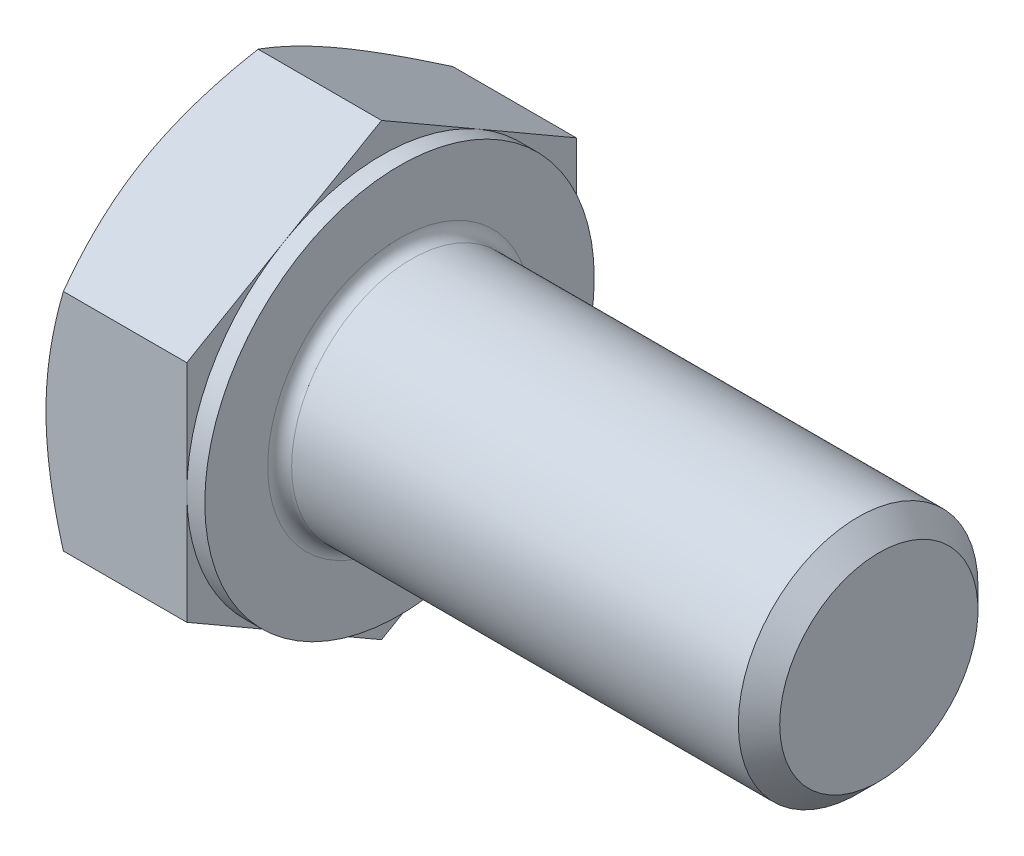
ISO-10303-21;
HEADER;
FILE_DESCRIPTION(('STEP AP214'),'2;1');
FILE_NAME('part.step','',(''),(''),'','','');
FILE_SCHEMA(('AUTOMOTIVE_DESIGN { 1 0 10303 214 1 1 1 1 }'));
ENDSEC;
DATA;
#1=APPLICATION_CONTEXT('core data for automotive mechanical design processes');
#2=APPLICATION_PROTOCOL_DEFINITION('international standard','automotive_design',2000,#1);
#3=PRODUCT_CONTEXT('',#1,'mechanical');
#4=PRODUCT('Part','Part','',(#3));
#5=PRODUCT_RELATED_PRODUCT_CATEGORY('part','',(#4));
#6=PRODUCT_DEFINITION_FORMATION('','',#4);
#7=PRODUCT_DEFINITION_CONTEXT('part definition',#1,'design');
#8=PRODUCT_DEFINITION('design','',#6,#7);
#9=PRODUCT_DEFINITION_SHAPE('','',#8);
#10=(LENGTH_UNIT() NAMED_UNIT(*) SI_UNIT(.MILLI.,.METRE.));
#11=(NAMED_UNIT(*) PLANE_ANGLE_UNIT() SI_UNIT($,.RADIAN.));
#12=(NAMED_UNIT(*) SI_UNIT($,.STERADIAN.) SOLID_ANGLE_UNIT());
#13=UNCERTAINTY_MEASURE_WITH_UNIT(LENGTH_MEASURE(1.E-05),#10,'distance_accuracy_value','');
#14=(GEOMETRIC_REPRESENTATION_CONTEXT(3) GLOBAL_UNCERTAINTY_ASSIGNED_CONTEXT((#13)) GLOBAL_UNIT_ASSIGNED_CONTEXT((#10,
#11,#12)) REPRESENTATION_CONTEXT('',''));
#15=CARTESIAN_POINT('',(0.,0.,0.));
#16=DIRECTION('',(0.,0.,1.));
#17=DIRECTION('',(1.,0.,0.));
#18=AXIS2_PLACEMENT_3D('',#15,#16,#17);
#19=CARTESIAN_POINT('',(5.3,7.50555349946514,0.));
#20=DIRECTION('',(1.,0.,0.));
#21=DIRECTION('',(0.,0.,-1.));
#22=AXIS2_PLACEMENT_3D('',#19,#20,#21);
#23=PLANE('',#22);
#24=CARTESIAN_POINT('',(5.3,0.,0.));
#25=DIRECTION('',(1.,0.,0.));
#26=DIRECTION('',(0.,0.,-1.));
#27=AXIS2_PLACEMENT_3D('',#24,#25,#26);
#28=CIRCLE('',#27,4.4);
#29=CARTESIAN_POINT('',(5.3,0.,-4.4));
#30=VERTEX_POINT('',#29);
#31=EDGE_CURVE('E50',#30,#30,#28,.F.);
#32=ORIENTED_EDGE('',*,*,#31,.T.);
#33=EDGE_LOOP('',(#32));
#34=FACE_BOUND('',#33,.T.);
#35=CARTESIAN_POINT('',(5.3,0.,0.));
#36=DIRECTION('',(1.,0.,0.));
#37=DIRECTION('',(0.,0.,-1.));
#38=AXIS2_PLACEMENT_3D('',#35,#36,#37);
#39=CIRCLE('',#38,6.5);
#40=CARTESIAN_POINT('',(5.3,0.,-6.5));
#41=VERTEX_POINT('',#40);
#42=EDGE_CURVE('E269',#41,#41,#39,.T.);
#43=ORIENTED_EDGE('',*,*,#42,.T.);
#44=EDGE_LOOP('',(#43));
#45=FACE_BOUND('',#44,.T.);
#46=ADVANCED_FACE('F41',(#34,#45),#23,.T.);
#47=CARTESIAN_POINT('',(0.,0.,0.));
#48=DIRECTION('',(-1.,0.,0.));
#49=DIRECTION('',(0.,0.,1.));
#50=AXIS2_PLACEMENT_3D('',#47,#48,#49);
#51=CYLINDRICAL_SURFACE('',#50,4.);
#52=CARTESIAN_POINT('',(5.7,0.,0.));
#53=DIRECTION('',(1.,0.,0.));
#54=DIRECTION('',(0.,0.,-1.));
#55=AXIS2_PLACEMENT_3D('',#52,#53,#54);
#56=CIRCLE('',#55,4.);
#57=CARTESIAN_POINT('',(5.7,0.,-4.));
#58=VERTEX_POINT('',#57);
#59=EDGE_CURVE('E11',#58,#58,#56,.T.);
#60=ORIENTED_EDGE('',*,*,#59,.T.);
#61=EDGE_LOOP('',(#60));
#62=FACE_BOUND('',#61,.T.);
#63=CARTESIAN_POINT('',(20.6095,0.,0.));
#64=DIRECTION('',(-1.,0.,0.));
#65=DIRECTION('',(0.,0.,1.));
#66=AXIS2_PLACEMENT_3D('',#63,#64,#65);
#67=CIRCLE('',#66,4.);
#68=CARTESIAN_POINT('',(20.6095,0.,4.));
#69=VERTEX_POINT('',#68);
#70=EDGE_CURVE('E313',#69,#69,#67,.T.);
#71=ORIENTED_EDGE('',*,*,#70,.T.);
#72=EDGE_LOOP('',(#71));
#73=FACE_BOUND('',#72,.T.);
#74=ADVANCED_FACE('F256',(#62,#73),#51,.T.);
#75=CARTESIAN_POINT('',(21.3,0.,0.));
#76=DIRECTION('',(-1.,0.,0.));
#77=DIRECTION('',(0.,0.,1.));
#78=AXIS2_PLACEMENT_3D('',#75,#76,#77);
#79=CONICAL_SURFACE('',#78,3.3095,0.785398163397441);
#80=ORIENTED_EDGE('',*,*,#70,.F.);
#81=EDGE_LOOP('',(#80));
#82=FACE_BOUND('',#81,.T.);
#83=CARTESIAN_POINT('',(21.3,0.,0.));
#84=DIRECTION('',(-1.,0.,0.));
#85=DIRECTION('',(0.,0.,1.));
#86=AXIS2_PLACEMENT_3D('',#83,#84,#85);
#87=CIRCLE('',#86,3.3095);
#88=CARTESIAN_POINT('',(21.3,0.,3.3095));
#89=VERTEX_POINT('',#88);
#90=EDGE_CURVE('E315',#89,#89,#87,.T.);
#91=ORIENTED_EDGE('',*,*,#90,.T.);
#92=EDGE_LOOP('',(#91));
#93=FACE_BOUND('',#92,.T.);
#94=ADVANCED_FACE('F261',(#82,#93),#79,.T.);
#95=CARTESIAN_POINT('',(21.3,0.,0.));
#96=DIRECTION('',(-1.,0.,0.));
#97=DIRECTION('',(0.,0.,1.));
#98=AXIS2_PLACEMENT_3D('',#95,#96,#97);
#99=PLANE('',#98);
#100=ORIENTED_EDGE('',*,*,#90,.F.);
#101=EDGE_LOOP('',(#100));
#102=FACE_BOUND('',#101,.T.);
#103=ADVANCED_FACE('F362',(#102),#99,.F.);
#104=CARTESIAN_POINT('',(4.7,6.5,0.));
#105=DIRECTION('',(1.,0.,0.));
#106=DIRECTION('',(0.,0.,-1.));
#107=AXIS2_PLACEMENT_3D('',#104,#105,#106);
#108=PLANE('',#107);
#109=DIRECTION('',(0.,0.500000000000001,0.866025403784438));
#110=VECTOR('',#109,1.);
#111=CARTESIAN_POINT('',(4.7,3.75277674973256,-6.5));
#112=LINE('',#111,#110);
#113=CARTESIAN_POINT('',(4.7,3.75277674973256,-6.5));
#114=VERTEX_POINT('',#113);
#115=CARTESIAN_POINT('',(4.7,5.62916512459885,-3.25));
#116=VERTEX_POINT('',#115);
#117=EDGE_CURVE('E174',#114,#116,#112,.T.);
#118=ORIENTED_EDGE('',*,*,#117,.T.);
#119=CARTESIAN_POINT('',(4.7,0.,0.));
#120=DIRECTION('',(-1.,0.,0.));
#121=DIRECTION('',(0.,0.,1.));
#122=AXIS2_PLACEMENT_3D('',#119,#120,#121);
#123=CIRCLE('',#122,6.5);
#124=CARTESIAN_POINT('',(4.7,0.,-6.5));
#125=VERTEX_POINT('',#124);
#126=EDGE_CURVE('E57',#116,#125,#123,.T.);
#127=ORIENTED_EDGE('',*,*,#126,.T.);
#128=DIRECTION('',(0.,1.,0.));
#129=VECTOR('',#128,1.);
#130=CARTESIAN_POINT('',(4.7,3.75277674973256,-6.5));
#131=LINE('',#130,#129);
#132=EDGE_CURVE('E270',#125,#114,#131,.T.);
#133=ORIENTED_EDGE('',*,*,#132,.T.);
#134=EDGE_LOOP('',(#118,#127,#133));
#135=FACE_BOUND('',#134,.T.);
#136=ADVANCED_FACE('F292',(#135),#108,.T.);
#137=CARTESIAN_POINT('',(4.7,7.50555349946514,0.));
#138=VERTEX_POINT('',#137);
#139=EDGE_CURVE('E172',#116,#138,#112,.T.);
#140=ORIENTED_EDGE('',*,*,#139,.T.);
#141=DIRECTION('',(0.,-0.500000000000001,0.866025403784438));
#142=VECTOR('',#141,1.);
#143=CARTESIAN_POINT('',(4.7,7.50555349946514,0.));
#144=LINE('',#143,#142);
#145=CARTESIAN_POINT('',(4.7,5.62916512459885,3.25));
#146=VERTEX_POINT('',#145);
#147=EDGE_CURVE('E171',#138,#146,#144,.T.);
#148=ORIENTED_EDGE('',*,*,#147,.T.);
#149=EDGE_CURVE('E160',#146,#116,#123,.T.);
#150=ORIENTED_EDGE('',*,*,#149,.T.);
#151=EDGE_LOOP('',(#140,#148,#150));
#152=FACE_BOUND('',#151,.T.);
#153=ADVANCED_FACE('F299',(#152),#108,.T.);
#154=CARTESIAN_POINT('',(4.7,3.75277674973257,6.5));
#155=VERTEX_POINT('',#154);
#156=EDGE_CURVE('E139',#146,#155,#144,.T.);
#157=ORIENTED_EDGE('',*,*,#156,.T.);
#158=DIRECTION('',(0.,-1.,0.));
#159=VECTOR('',#158,1.);
#160=CARTESIAN_POINT('',(4.7,3.75277674973257,6.5));
#161=LINE('',#160,#159);
#162=CARTESIAN_POINT('',(4.7,0.,6.5));
#163=VERTEX_POINT('',#162);
#164=EDGE_CURVE('E133',#155,#163,#161,.T.);
#165=ORIENTED_EDGE('',*,*,#164,.T.);
#166=EDGE_CURVE('E137',#163,#146,#123,.T.);
#167=ORIENTED_EDGE('',*,*,#166,.T.);
#168=EDGE_LOOP('',(#157,#165,#167));
#169=FACE_BOUND('',#168,.T.);
#170=ADVANCED_FACE('F135',(#169),#108,.T.);
#171=CARTESIAN_POINT('',(4.7,-3.75277674973257,6.5));
#172=VERTEX_POINT('',#171);
#173=EDGE_CURVE('E143',#163,#172,#161,.T.);
#174=ORIENTED_EDGE('',*,*,#173,.T.);
#175=DIRECTION('',(0.,-0.500000000000001,-0.866025403784438));
#176=VECTOR('',#175,1.);
#177=CARTESIAN_POINT('',(4.7,-7.50555349946515,0.));
#178=LINE('',#177,#176);
#179=CARTESIAN_POINT('',(4.7,-5.62916512459885,3.25000000000001));
#180=VERTEX_POINT('',#179);
#181=EDGE_CURVE('E150',#172,#180,#178,.T.);
#182=ORIENTED_EDGE('',*,*,#181,.T.);
#183=EDGE_CURVE('E147',#180,#163,#123,.T.);
#184=ORIENTED_EDGE('',*,*,#183,.T.);
#185=EDGE_LOOP('',(#174,#182,#184));
#186=FACE_BOUND('',#185,.T.);
#187=ADVANCED_FACE('F148',(#186),#108,.T.);
#188=CARTESIAN_POINT('',(4.7,-7.50555349946515,0.));
#189=VERTEX_POINT('',#188);
#190=EDGE_CURVE('E166',#180,#189,#178,.T.);
#191=ORIENTED_EDGE('',*,*,#190,.T.);
#192=DIRECTION('',(0.,0.5,-0.866025403784438));
#193=VECTOR('',#192,1.);
#194=CARTESIAN_POINT('',(4.7,-3.75277674973257,-6.5));
#195=LINE('',#194,#193);
#196=CARTESIAN_POINT('',(4.7,-5.62916512459885,-3.25));
#197=VERTEX_POINT('',#196);
#198=EDGE_CURVE('E353',#189,#197,#195,.T.);
#199=ORIENTED_EDGE('',*,*,#198,.T.);
#200=EDGE_CURVE('E154',#197,#180,#123,.T.);
#201=ORIENTED_EDGE('',*,*,#200,.T.);
#202=EDGE_LOOP('',(#191,#199,#201));
#203=FACE_BOUND('',#202,.T.);
#204=ADVANCED_FACE('F354',(#203),#108,.T.);
#205=CARTESIAN_POINT('',(4.7,-3.75277674973257,-6.5));
#206=VERTEX_POINT('',#205);
#207=EDGE_CURVE('E161',#197,#206,#195,.T.);
#208=ORIENTED_EDGE('',*,*,#207,.T.);
#209=EDGE_CURVE('E273',#206,#125,#131,.T.);
#210=ORIENTED_EDGE('',*,*,#209,.T.);
#211=EDGE_CURVE('E285',#125,#197,#123,.T.);
#212=ORIENTED_EDGE('',*,*,#211,.T.);
#213=EDGE_LOOP('',(#208,#210,#212));
#214=FACE_BOUND('',#213,.T.);
#215=ADVANCED_FACE('F284',(#214),#108,.T.);
#216=CARTESIAN_POINT('',(0.,0.,0.));
#217=DIRECTION('',(-1.,0.,0.));
#218=DIRECTION('',(0.,0.,1.));
#219=AXIS2_PLACEMENT_3D('',#216,#217,#218);
#220=CYLINDRICAL_SURFACE('',#219,6.5);
#221=ORIENTED_EDGE('',*,*,#126,.F.);
#222=ORIENTED_EDGE('',*,*,#149,.F.);
#223=ORIENTED_EDGE('',*,*,#166,.F.);
#224=ORIENTED_EDGE('',*,*,#183,.F.);
#225=ORIENTED_EDGE('',*,*,#200,.F.);
#226=ORIENTED_EDGE('',*,*,#211,.F.);
#227=EDGE_LOOP('',(#221,#222,#223,#224,#225,#226));
#228=FACE_BOUND('',#227,.T.);
#229=ORIENTED_EDGE('',*,*,#42,.F.);
#230=EDGE_LOOP('',(#229));
#231=FACE_BOUND('',#230,.T.);
#232=ADVANCED_FACE('F157',(#228,#231),#220,.T.);
#233=CARTESIAN_POINT('',(0.,7.50555349946514,0.));
#234=DIRECTION('',(1.,0.,0.));
#235=DIRECTION('',(0.,0.,-1.));
#236=AXIS2_PLACEMENT_3D('',#233,#234,#235);
#237=PLANE('',#236);
#238=CARTESIAN_POINT('',(0.,0.,0.));
#239=DIRECTION('',(1.,0.,0.));
#240=DIRECTION('',(0.,0.,-1.));
#241=AXIS2_PLACEMENT_3D('',#238,#239,#240);
#242=CIRCLE('',#241,6.5);
#243=CARTESIAN_POINT('',(0.,0.,-6.5));
#244=VERTEX_POINT('',#243);
#245=CARTESIAN_POINT('',(0.,5.62916512459885,-3.25000000000001));
#246=VERTEX_POINT('',#245);
#247=EDGE_CURVE('E271',#244,#246,#242,.T.);
#248=ORIENTED_EDGE('',*,*,#247,.F.);
#249=CARTESIAN_POINT('',(0.,-5.62916512459885,-3.25));
#250=VERTEX_POINT('',#249);
#251=EDGE_CURVE('E277',#250,#244,#242,.T.);
#252=ORIENTED_EDGE('',*,*,#251,.F.);
#253=CARTESIAN_POINT('',(0.,-5.62916512459885,3.25000000000001));
#254=VERTEX_POINT('',#253);
#255=EDGE_CURVE('E335',#254,#250,#242,.T.);
#256=ORIENTED_EDGE('',*,*,#255,.F.);
#257=CARTESIAN_POINT('',(0.,0.,6.5));
#258=VERTEX_POINT('',#257);
#259=EDGE_CURVE('E331',#258,#254,#242,.T.);
#260=ORIENTED_EDGE('',*,*,#259,.F.);
#261=CARTESIAN_POINT('',(0.,0.,0.));
#262=DIRECTION('',(-1.,0.,0.));
#263=DIRECTION('',(0.,0.,1.));
#264=AXIS2_PLACEMENT_3D('',#261,#262,#263);
#265=CIRCLE('',#264,6.5);
#266=CARTESIAN_POINT('',(0.,5.62916512459885,3.25));
#267=VERTEX_POINT('',#266);
#268=EDGE_CURVE('E175',#258,#267,#265,.T.);
#269=ORIENTED_EDGE('',*,*,#268,.T.);
#270=EDGE_CURVE('E275',#246,#267,#242,.T.);
#271=ORIENTED_EDGE('',*,*,#270,.F.);
#272=EDGE_LOOP('',(#248,#252,#256,#260,#269,#271));
#273=FACE_BOUND('',#272,.T.);
#274=ADVANCED_FACE('F332',(#273),#237,.F.);
#275=CARTESIAN_POINT('',(0.,0.,0.));
#276=DIRECTION('',(1.,0.,0.));
#277=DIRECTION('',(0.,0.,-1.));
#278=AXIS2_PLACEMENT_3D('',#275,#276,#277);
#279=CONICAL_SURFACE('',#278,6.5,1.0471975511966);
#280=CARTESIAN_POINT('',(0.580623251805861,3.75266127967873,6.5002));
#281=CARTESIAN_POINT('',(0.53300442307548,3.8351516191275,6.35732254094112));
#282=CARTESIAN_POINT('',(0.487546700602701,3.91794952254312,6.21391236546509));
#283=CARTESIAN_POINT('',(0.401548682023042,4.08421773795794,5.9259273686828));
#284=CARTESIAN_POINT('',(0.361010507228022,4.16768832359105,5.78135207342874));
#285=CARTESIAN_POINT('',(0.247571001123207,4.41943655294051,5.34531134947997));
#286=CARTESIAN_POINT('',(0.183047807128738,4.58870793403689,5.05212471715368));
#287=CARTESIAN_POINT('',(0.107386583547491,4.84201947708215,4.61337625445563));
#288=CARTESIAN_POINT('',(0.0858328564569874,4.92530276780316,4.46912536350531));
#289=CARTESIAN_POINT('',(0.0496903146061193,5.09224566542477,4.17997178286191));
#290=CARTESIAN_POINT('',(0.0351008844596669,5.17590523841627,4.03506915190111));
#291=CARTESIAN_POINT('',(0.0132587525073473,5.34336968579964,3.74501222057168));
#292=CARTESIAN_POINT('',(0.0059977243221085,5.427174286676,3.59985839394579));
#293=CARTESIAN_POINT('',(-0.00103969741776754,5.59485627940483,3.30942466302506));
#294=CARTESIAN_POINT('',(-0.000816322187794126,5.6787336689286,3.16414476276365));
#295=CARTESIAN_POINT('',(0.0100834585151664,5.90853103021317,2.76612405757351));
#296=CARTESIAN_POINT('',(0.0283818178694138,6.05437578112763,2.51351353897243));
#297=CARTESIAN_POINT('',(0.086406341457675,6.34509659313135,2.00997032176432));
#298=CARTESIAN_POINT('',(0.126152338538245,6.48997163178545,1.75903939406692));
#299=CARTESIAN_POINT('',(0.225505903202149,6.78127752911039,1.25448277935568));
#300=CARTESIAN_POINT('',(0.285534425638026,6.92767163007068,1.00092075856409));
#301=CARTESIAN_POINT('',(0.421774992509867,7.21827667013277,0.497578064240956));
#302=CARTESIAN_POINT('',(0.497955034163591,7.36249133098589,0.247790944447036));
#303=CARTESIAN_POINT('',(0.580623251805865,7.50566896951898,-0.000200000000000185));
#304=B_SPLINE_CURVE_WITH_KNOTS('',3,(#280,#281,#282,#283,#284,#285,#286,#287,#288,#289,#290,
#291,#292,#293,#294,#295,#296,#297,#298,#299,#300,#301,#302,#303),.UNSPECIFIED.,.F.,.F.,(4,2,2,
2,2,2,2,2,2,2,2,4),(0.,0.515105052395587,1.03043143507524,2.06322554824262,2.56697389547996,
3.07067772176453,3.57380860368927,4.07692394242519,4.9527935470566,5.82947446853466,
6.72559912449736,7.61996451221046),.UNSPECIFIED.);
#305=CARTESIAN_POINT('',(0.580556583600761,7.50555349946514,0.));
#306=VERTEX_POINT('',#305);
#307=EDGE_CURVE('E224',#267,#306,#304,.T.);
#308=ORIENTED_EDGE('',*,*,#307,.T.);
#309=CARTESIAN_POINT('',(0.580623251805865,7.50566896951898,0.000199999999999942));
#310=CARTESIAN_POINT('',(0.533004423075484,7.4231786300702,-0.14267745905888));
#311=CARTESIAN_POINT('',(0.487546700602705,7.34038072665458,-0.286087634534912));
#312=CARTESIAN_POINT('',(0.401548682023045,7.17411251123976,-0.574072631317194));
#313=CARTESIAN_POINT('',(0.361010507228024,7.09064192560665,-0.718647926571263));
#314=CARTESIAN_POINT('',(0.247571001123208,6.83889369625719,-1.15468865052003));
#315=CARTESIAN_POINT('',(0.18304780712874,6.66962231516081,-1.44787528284632));
#316=CARTESIAN_POINT('',(0.107386583547492,6.41631077211555,-1.88662374554437));
#317=CARTESIAN_POINT('',(0.0858328564569881,6.33302748139454,-2.03087463649469));
#318=CARTESIAN_POINT('',(0.0496903146061196,6.16608458377293,-2.32002821713809));
#319=CARTESIAN_POINT('',(0.0351008844596673,6.08242501078143,-2.46493084809889));
#320=CARTESIAN_POINT('',(0.0132587525073475,5.91496056339807,-2.75498777942832));
#321=CARTESIAN_POINT('',(0.00599772432210842,5.8311559625217,-2.90014160605421));
#322=CARTESIAN_POINT('',(-0.00103969741776819,5.66347396979287,-3.19057533697495));
#323=CARTESIAN_POINT('',(-0.000816322187795032,5.5795965802691,-3.33585523723635));
#324=CARTESIAN_POINT('',(0.0100834585151652,5.34979921898453,-3.73387594242649));
#325=CARTESIAN_POINT('',(0.0283818178694129,5.20395446807007,-3.98648646102757));
#326=CARTESIAN_POINT('',(0.0864063414576737,4.91323365606636,-4.49002967823568));
#327=CARTESIAN_POINT('',(0.126152338538243,4.76835861741226,-4.74096060593308));
#328=CARTESIAN_POINT('',(0.225505903202146,4.47705272008732,-5.24551722064432));
#329=CARTESIAN_POINT('',(0.285534425638022,4.33065861912702,-5.49907924143591));
#330=CARTESIAN_POINT('',(0.421774992509863,4.04005357906493,-6.00242193575904));
#331=CARTESIAN_POINT('',(0.497955034163587,3.89583891821181,-6.25220905555296));
#332=CARTESIAN_POINT('',(0.580623251805861,3.75266127967873,-6.5002));
#333=B_SPLINE_CURVE_WITH_KNOTS('',3,(#309,#310,#311,#312,#313,#314,#315,#316,#317,#318,#319,
#320,#321,#322,#323,#324,#325,#326,#327,#328,#329,#330,#331,#332),.UNSPECIFIED.,.F.,.F.,(4,2,2,
2,2,2,2,2,2,2,2,4),(0.,0.515105052395587,1.03043143507524,2.06322554824262,2.56697389547996,
3.07067772176453,3.57380860368928,4.0769239424252,4.9527935470566,5.82947446853466,
6.72559912449736,7.61996451221046),.UNSPECIFIED.);
#334=EDGE_CURVE('E65',#306,#246,#333,.T.);
#335=ORIENTED_EDGE('',*,*,#334,.T.);
#336=ORIENTED_EDGE('',*,*,#270,.T.);
#337=EDGE_LOOP('',(#308,#335,#336));
#338=FACE_BOUND('',#337,.T.);
#339=ADVANCED_FACE('F329',(#338),#279,.T.);
#340=CARTESIAN_POINT('',(3.18835311563216,-10.1137456673369,6.5));
#341=CARTESIAN_POINT('',(3.05034773984569,-9.82952666268363,6.5));
#342=CARTESIAN_POINT('',(2.91365616465169,-9.54465869597371,6.5));
#343=CARTESIAN_POINT('',(2.64363899475027,-8.9732797800977,6.5));
#344=CARTESIAN_POINT('',(2.51031392437707,-8.68676858342199,6.5));
#345=CARTESIAN_POINT('',(2.24710473463579,-8.11029837800201,6.5));
#346=CARTESIAN_POINT('',(2.11724300420665,-7.82032911160932,6.5));
#347=CARTESIAN_POINT('',(1.8627908281112,-7.23809540985589,6.5));
#348=CARTESIAN_POINT('',(1.73820013539997,-6.94583108282378,6.5));
#349=CARTESIAN_POINT('',(1.49176685414525,-6.34906440932191,6.5));
#350=CARTESIAN_POINT('',(1.37014257629961,-6.04447142260091,6.5));
#351=CARTESIAN_POINT('',(1.13601865749048,-5.43173420932697,6.5));
#352=CARTESIAN_POINT('',(1.02352003549992,-5.12358959057326,6.5));
#353=CARTESIAN_POINT('',(0.810575368179996,-4.50382569763974,6.5));
#354=CARTESIAN_POINT('',(0.71010523225176,-4.19221478250845,6.5));
#355=CARTESIAN_POINT('',(0.524420166111963,-3.56452019194196,6.5));
#356=CARTESIAN_POINT('',(0.439200468182006,-3.248437947833,6.5));
#357=CARTESIAN_POINT('',(0.288524223393067,-2.61335465708694,6.5));
#358=CARTESIAN_POINT('',(0.22296186574418,-2.29437912058767,6.5));
#359=CARTESIAN_POINT('',(0.115312883140192,-1.65238219411908,6.5));
#360=CARTESIAN_POINT('',(0.0732239014810092,-1.32936121363907,6.5));
#361=CARTESIAN_POINT('',(0.0304887136492793,-0.845231171985981,6.5));
#362=CARTESIAN_POINT('',(0.0196493434374818,-0.684982209825929,6.5));
#363=CARTESIAN_POINT('',(0.00475298486802839,-0.364162349261911,6.5));
#364=CARTESIAN_POINT('',(0.000695882912926891,-0.203591456295124,6.5));
#365=CARTESIAN_POINT('',(-0.000531597192431542,0.117577430127593,6.5));
#366=CARTESIAN_POINT('',(0.00229809016385244,0.278175423826775,6.5));
#367=CARTESIAN_POINT('',(0.0147726845392768,0.599108972527027,6.5));
#368=CARTESIAN_POINT('',(0.0244179260292899,0.759444514261294,6.5));
#369=CARTESIAN_POINT('',(0.0554961939005601,1.1436994656868,6.5));
#370=CARTESIAN_POINT('',(0.0801030490102252,1.36736763010324,6.5));
#371=CARTESIAN_POINT('',(0.141246537396775,1.81305591275148,6.5));
#372=CARTESIAN_POINT('',(0.177784759549959,2.035075807457,6.5));
#373=CARTESIAN_POINT('',(0.303360001243783,2.69839633393827,6.5));
#374=CARTESIAN_POINT('',(0.408335815043154,3.13672010332748,6.5));
#375=CARTESIAN_POINT('',(0.590564593006713,3.79232112874054,6.5));
#376=CARTESIAN_POINT('',(0.65631319884288,4.01299150829173,6.5));
#377=CARTESIAN_POINT('',(0.794681634048787,4.45218858961829,6.5));
#378=CARTESIAN_POINT('',(0.867301512962924,4.67071527592431,6.5));
#379=CARTESIAN_POINT('',(1.01824353836803,5.10569490203691,6.5));
#380=CARTESIAN_POINT('',(1.09656388214599,5.3221484731522,6.5));
#381=CARTESIAN_POINT('',(1.25798086145111,5.75325725721542,6.5));
#382=CARTESIAN_POINT('',(1.34107741015563,5.96791250277239,6.5));
#383=CARTESIAN_POINT('',(1.56029019561416,6.51888445883546,6.5));
#384=CARTESIAN_POINT('',(1.69936356644503,6.85402316761092,6.5));
#385=CARTESIAN_POINT('',(1.98501958064622,7.52109583887404,6.5));
#386=CARTESIAN_POINT('',(2.13160288757765,7.85302951508199,6.5));
#387=CARTESIAN_POINT('',(2.43059748021416,8.51437865467408,6.5));
#388=CARTESIAN_POINT('',(2.5830105757321,8.84379329733072,6.5));
#389=CARTESIAN_POINT('',(2.89234869350807,9.50047798633195,6.5));
#390=CARTESIAN_POINT('',(3.04927357195784,9.82774810062372,6.5));
#391=CARTESIAN_POINT('',(3.366920131061,10.4809971970749,6.5));
#392=CARTESIAN_POINT('',(3.5276467646709,10.8069737662429,6.5));
#393=CARTESIAN_POINT('',(3.85198555530078,11.4574882896093,6.5));
#394=CARTESIAN_POINT('',(4.01559773098171,11.7820262344869,6.5));
#395=CARTESIAN_POINT('',(4.50986184978696,12.753746810957,6.5));
#396=CARTESIAN_POINT('',(4.84399997953391,13.3991555927631,6.5));
#397=CARTESIAN_POINT('',(5.48575990240554,14.6239779286089,6.5));
#398=CARTESIAN_POINT('',(5.79279643346762,15.20369957558,6.5));
#399=CARTESIAN_POINT('',(6.41069188201843,16.3611382633071,6.5));
#400=CARTESIAN_POINT('',(6.72155098984202,16.9388552023926,6.5));
#401=CARTESIAN_POINT('',(7.34519775412865,18.0910273551188,6.5));
#402=CARTESIAN_POINT('',(7.65797694142592,18.6654871601314,6.5));
#403=CARTESIAN_POINT('',(8.28574397126577,19.8131486199609,6.5));
#404=CARTESIAN_POINT('',(8.6007316626767,20.3863503574121,6.5));
#405=CARTESIAN_POINT('',(8.91652967142029,20.9591024516606,6.5));
#406=B_SPLINE_CURVE_WITH_KNOTS('',3,(#340,#341,#342,#343,#344,#345,#346,#347,#348,#349,#350,
#351,#352,#353,#354,#355,#356,#357,#358,#359,#360,#361,#362,#363,#364,#365,#366,#367,#368,#369,
#370,#371,#372,#373,#374,#375,#376,#377,#378,#379,#380,#381,#382,#383,#384,#385,#386,#387,#388,
#389,#390,#391,#392,#393,#394,#395,#396,#397,#398,#399,#400,#401,#402,#403,#404,#405),
.UNSPECIFIED.,.F.,.F.,(4,2,2,2,2,2,2,2,2,2,2,2,2,2,2,2,2,2,2,2,2,2,2,2,2,2,2,2,2,2,2,2,4),(0.,
0.947868666637001,1.89588406470428,2.84900320910869,3.80207763278045,4.7858977404943,
5.76982755101459,6.75175256199403,7.73337005710129,8.70960474826444,9.68574140876309,
10.1674651045585,10.6491807317952,11.1309009410869,11.612644792267,12.2873175714037,
12.9620802320305,14.3123184370259,15.0030310333297,15.6937486103039,16.3842486961975,
17.074736234034,18.1631508671878,19.2516618366358,20.3405135130783,21.4293305219254,
22.519654053591,23.6099846390269,25.7902468223405,27.7582608860787,29.7263733417655,
31.6886408583916,33.6507753794604),.UNSPECIFIED.);
#407=CARTESIAN_POINT('',(0.580556583600757,3.75277674973256,6.5));
#408=VERTEX_POINT('',#407);
#409=EDGE_CURVE('E238',#258,#408,#406,.T.);
#410=ORIENTED_EDGE('',*,*,#409,.T.);
#411=EDGE_CURVE('E237',#408,#267,#304,.T.);
#412=ORIENTED_EDGE('',*,*,#411,.T.);
#413=ORIENTED_EDGE('',*,*,#268,.F.);
#414=EDGE_LOOP('',(#410,#412,#413));
#415=FACE_BOUND('',#414,.T.);
#416=ADVANCED_FACE('F326',(#415),#279,.T.);
#417=CARTESIAN_POINT('',(0.580556583600758,-3.75277674973257,6.5));
#418=VERTEX_POINT('',#417);
#419=EDGE_CURVE('E317',#418,#258,#406,.T.);
#420=ORIENTED_EDGE('',*,*,#419,.T.);
#421=ORIENTED_EDGE('',*,*,#259,.T.);
#422=CARTESIAN_POINT('',(0.580623251805869,-7.50566896951898,-0.000199999999999312));
#423=CARTESIAN_POINT('',(0.533004423075487,-7.42317863007021,0.142677459058881));
#424=CARTESIAN_POINT('',(0.487546700602708,-7.34038072665459,0.286087634534913));
#425=CARTESIAN_POINT('',(0.401548682023049,-7.17411251123977,0.574072631317195));
#426=CARTESIAN_POINT('',(0.361010507228029,-7.09064192560666,0.718647926571265));
#427=CARTESIAN_POINT('',(0.247571001123213,-6.8388936962572,1.15468865052003));
#428=CARTESIAN_POINT('',(0.183047807128744,-6.66962231516082,1.44787528284632));
#429=CARTESIAN_POINT('',(0.107386583547496,-6.41631077211556,1.88662374554437));
#430=CARTESIAN_POINT('',(0.0858328564569919,-6.33302748139455,2.03087463649469));
#431=CARTESIAN_POINT('',(0.0496903146061238,-6.16608458377294,2.32002821713809));
#432=CARTESIAN_POINT('',(0.0351008844596716,-6.08242501078144,2.46493084809889));
#433=CARTESIAN_POINT('',(0.0132587525073517,-5.91496056339807,2.75498777942832));
#434=CARTESIAN_POINT('',(0.00599772432211233,-5.83115596252171,2.90014160605421));
#435=CARTESIAN_POINT('',(-0.00103969741776435,-5.66347396979287,3.19057533697495));
#436=CARTESIAN_POINT('',(-0.000816322187790917,-5.57959658026911,3.33585523723636));
#437=CARTESIAN_POINT('',(0.0100834585151693,-5.34979921898454,3.73387594242649));
#438=CARTESIAN_POINT('',(0.0283818178694163,-5.20395446807007,3.98648646102757));
#439=CARTESIAN_POINT('',(0.0864063414576766,-4.91323365606636,4.49002967823568));
#440=CARTESIAN_POINT('',(0.126152338538246,-4.76835861741226,4.74096060593308));
#441=CARTESIAN_POINT('',(0.225505903202149,-4.47705272008732,5.24551722064432));
#442=CARTESIAN_POINT('',(0.285534425638026,-4.33065861912703,5.49907924143591));
#443=CARTESIAN_POINT('',(0.421774992509866,-4.04005357906494,6.00242193575904));
#444=CARTESIAN_POINT('',(0.497955034163589,-3.89583891821182,6.25220905555296));
#445=CARTESIAN_POINT('',(0.580623251805863,-3.75266127967873,6.5002));
#446=B_SPLINE_CURVE_WITH_KNOTS('',3,(#422,#423,#424,#425,#426,#427,#428,#429,#430,#431,#432,
#433,#434,#435,#436,#437,#438,#439,#440,#441,#442,#443,#444,#445),.UNSPECIFIED.,.F.,.F.,(4,2,2,
2,2,2,2,2,2,2,2,4),(0.,0.515105052395588,1.03043143507525,2.06322554824262,2.56697389547997,
3.07067772176454,3.57380860368928,4.0769239424252,4.9527935470566,5.82947446853467,
6.72559912449736,7.61996451221046),.UNSPECIFIED.);
#447=EDGE_CURVE('E226',#254,#418,#446,.T.);
#448=ORIENTED_EDGE('',*,*,#447,.T.);
#449=EDGE_LOOP('',(#420,#421,#448));
#450=FACE_BOUND('',#449,.T.);
#451=ADVANCED_FACE('F195',(#450),#279,.T.);
#452=CARTESIAN_POINT('',(0.580556583600765,-7.50555349946515,0.));
#453=VERTEX_POINT('',#452);
#454=EDGE_CURVE('E218',#453,#254,#446,.T.);
#455=ORIENTED_EDGE('',*,*,#454,.T.);
#456=ORIENTED_EDGE('',*,*,#255,.T.);
#457=CARTESIAN_POINT('',(0.580623251805865,-3.75266127967874,-6.5002));
#458=CARTESIAN_POINT('',(0.533004423075483,-3.83515161912751,-6.35732254094112));
#459=CARTESIAN_POINT('',(0.487546700602705,-3.91794952254313,-6.21391236546509));
#460=CARTESIAN_POINT('',(0.401548682023045,-4.08421773795795,-5.92592736868281));
#461=CARTESIAN_POINT('',(0.361010507228025,-4.16768832359106,-5.78135207342874));
#462=CARTESIAN_POINT('',(0.24757100112321,-4.41943655294052,-5.34531134947997));
#463=CARTESIAN_POINT('',(0.183047807128741,-4.5887079340369,-5.05212471715368));
#464=CARTESIAN_POINT('',(0.107386583547495,-4.84201947708216,-4.61337625445563));
#465=CARTESIAN_POINT('',(0.0858328564569908,-4.92530276780317,-4.46912536350531));
#466=CARTESIAN_POINT('',(0.0496903146061231,-5.09224566542478,-4.17997178286191));
#467=CARTESIAN_POINT('',(0.0351008844596713,-5.17590523841628,-4.03506915190111));
#468=CARTESIAN_POINT('',(0.0132587525073519,-5.34336968579964,-3.74501222057168));
#469=CARTESIAN_POINT('',(0.00599772432211273,-5.42717428667601,-3.59985839394579));
#470=CARTESIAN_POINT('',(-0.00103969741776374,-5.59485627940484,-3.30942466302505));
#471=CARTESIAN_POINT('',(-0.000816322187790392,-5.67873366892861,-3.16414476276364));
#472=CARTESIAN_POINT('',(0.0100834585151705,-5.90853103021318,-2.76612405757351));
#473=CARTESIAN_POINT('',(0.0283818178694188,-6.05437578112764,-2.51351353897243));
#474=CARTESIAN_POINT('',(0.0864063414576805,-6.34509659313135,-2.00997032176432));
#475=CARTESIAN_POINT('',(0.12615233853825,-6.48997163178545,-1.75903939406692));
#476=CARTESIAN_POINT('',(0.225505903202154,-6.78127752911039,-1.25448277935568));
#477=CARTESIAN_POINT('',(0.28553442563803,-6.92767163007069,-1.00092075856409));
#478=CARTESIAN_POINT('',(0.421774992509871,-7.21827667013278,-0.497578064240956));
#479=CARTESIAN_POINT('',(0.497955034163595,-7.3624913309859,-0.247790944447036));
#480=CARTESIAN_POINT('',(0.580623251805869,-7.50566896951898,0.000199999999999799));
#481=B_SPLINE_CURVE_WITH_KNOTS('',3,(#457,#458,#459,#460,#461,#462,#463,#464,#465,#466,#467,
#468,#469,#470,#471,#472,#473,#474,#475,#476,#477,#478,#479,#480),.UNSPECIFIED.,.F.,.F.,(4,2,2,
2,2,2,2,2,2,2,2,4),(0.,0.515105052395587,1.03043143507524,2.06322554824262,2.56697389547996,
3.07067772176453,3.57380860368927,4.0769239424252,4.9527935470566,5.82947446853466,
6.72559912449736,7.61996451221046),.UNSPECIFIED.);
#482=EDGE_CURVE('E225',#250,#453,#481,.T.);
#483=ORIENTED_EDGE('',*,*,#482,.T.);
#484=EDGE_LOOP('',(#455,#456,#483));
#485=FACE_BOUND('',#484,.T.);
#486=ADVANCED_FACE('F349',(#485),#279,.T.);
#487=CARTESIAN_POINT('',(0.580556583600757,3.75277674973256,-6.5));
#488=VERTEX_POINT('',#487);
#489=EDGE_CURVE('E227',#246,#488,#333,.T.);
#490=ORIENTED_EDGE('',*,*,#489,.T.);
#491=CARTESIAN_POINT('',(3.18835311590243,-10.1137456678934,-6.5));
#492=CARTESIAN_POINT('',(3.05034774010466,-9.82952666322138,-6.5));
#493=CARTESIAN_POINT('',(2.91365616489936,-9.54465869649273,-6.5));
#494=CARTESIAN_POINT('',(2.64363899497539,-8.97327978057921,-6.5));
#495=CARTESIAN_POINT('',(2.51031392459094,-8.68676858388472,-6.5));
#496=CARTESIAN_POINT('',(2.24710473482717,-8.11029837842688,-6.5));
#497=CARTESIAN_POINT('',(2.11724300438678,-7.82032911201511,-6.5));
#498=CARTESIAN_POINT('',(1.86279082826901,-7.23809541022339,-6.5));
#499=CARTESIAN_POINT('',(1.73820013554673,-6.94583108317207,-6.5));
#500=CARTESIAN_POINT('',(1.4917668542696,-6.34906440963036,-6.5));
#501=CARTESIAN_POINT('',(1.37014257641264,-6.04447142288872,-6.5));
#502=CARTESIAN_POINT('',(1.13601865758148,-5.43173420957315,-6.5));
#503=CARTESIAN_POINT('',(1.02352003558021,-5.12358959079846,-6.5));
#504=CARTESIAN_POINT('',(0.810575368239911,-4.50382569782259,-6.5));
#505=CARTESIAN_POINT('',(0.710105232302,-4.19221478266993,-6.5));
#506=CARTESIAN_POINT('',(0.52442016614445,-3.56452019206012,-6.5));
#507=CARTESIAN_POINT('',(0.439200468206415,-3.24843794792921,-6.5));
#508=CARTESIAN_POINT('',(0.288524223401196,-2.61335465712783,-6.5));
#509=CARTESIAN_POINT('',(0.222961865744747,-2.29437912059505,-6.5));
#510=CARTESIAN_POINT('',(0.115312883130725,-1.65238219405862,-6.5));
#511=CARTESIAN_POINT('',(0.0732239014690635,-1.3293612135443,-6.5));
#512=CARTESIAN_POINT('',(0.0304887136381669,-0.845231171839984,-6.5));
#513=CARTESIAN_POINT('',(0.0196493434273847,-0.684982209663102,-6.5));
#514=CARTESIAN_POINT('',(0.00475298486144082,-0.36416234906546,-6.5));
#515=CARTESIAN_POINT('',(0.000695882908833378,-0.203591456081879,-6.5));
#516=CARTESIAN_POINT('',(-0.000531597190093827,0.117577430374297,-6.5));
#517=CARTESIAN_POINT('',(0.00229809017012765,0.278175424090143,-6.5));
#518=CARTESIAN_POINT('',(0.0147726845547645,0.599108972823506,-6.5));
#519=CARTESIAN_POINT('',(0.0244179260500527,0.759444514574217,-6.5));
#520=CARTESIAN_POINT('',(0.0554961939343012,1.14369946602534,-6.5));
#521=CARTESIAN_POINT('',(0.0801030490514527,1.36736763045086,-6.5));
#522=CARTESIAN_POINT('',(0.141246537453378,1.81305591311688,-6.5));
#523=CARTESIAN_POINT('',(0.177784759614453,2.03507580783109,-6.5));
#524=CARTESIAN_POINT('',(0.303360001332117,2.69839633433797,-6.5));
#525=CARTESIAN_POINT('',(0.408335815147597,3.13672010374359,-6.5));
#526=CARTESIAN_POINT('',(0.590564593134945,3.79232112918121,-6.5));
#527=CARTESIAN_POINT('',(0.656313198979096,4.01299150874076,-6.5));
#528=CARTESIAN_POINT('',(0.794681634200737,4.45218859008394,-6.5));
#529=CARTESIAN_POINT('',(0.867301513122623,4.67071527639823,-6.5));
#530=CARTESIAN_POINT('',(1.01824353854296,5.1056949025273,-6.5));
#531=CARTESIAN_POINT('',(1.0965638823284,5.3221484736508,-6.5));
#532=CARTESIAN_POINT('',(1.25798086164822,5.75325725773044,-6.5));
#533=CARTESIAN_POINT('',(1.34107741035996,5.96791250329561,-6.5));
#534=CARTESIAN_POINT('',(1.56029019583042,6.51888445936378,-6.5));
#535=CARTESIAN_POINT('',(1.69936356666535,6.85402316813632,-6.5));
#536=CARTESIAN_POINT('',(1.98501958087353,7.52109583939398,-6.5));
#537=CARTESIAN_POINT('',(2.13160288780792,7.85302951559938,-6.5));
#538=CARTESIAN_POINT('',(2.43059748044952,8.51437865518663,-6.5));
#539=CARTESIAN_POINT('',(2.58301057596959,8.84379329784099,-6.5));
#540=CARTESIAN_POINT('',(2.89234869374927,9.50047798683789,-6.5));
#541=CARTESIAN_POINT('',(3.04927357220059,9.82774810112762,-6.5));
#542=CARTESIAN_POINT('',(3.36692013130636,10.4809971975748,-6.5));
#543=CARTESIAN_POINT('',(3.52764676491733,10.8069737667409,-6.5));
#544=CARTESIAN_POINT('',(3.85198555554899,11.4574882901034,-6.5));
#545=CARTESIAN_POINT('',(4.01559773123065,11.7820262349793,-6.5));
#546=CARTESIAN_POINT('',(4.50986185003772,12.7537468114441,-6.5));
#547=CARTESIAN_POINT('',(4.84399997978539,13.3991555932469,-6.5));
#548=CARTESIAN_POINT('',(5.48575990265918,14.6239779290895,-6.5));
#549=CARTESIAN_POINT('',(5.79279643372277,15.2036995760605,-6.5));
#550=CARTESIAN_POINT('',(6.41069188227628,16.3611382637875,-6.5));
#551=CARTESIAN_POINT('',(6.72155099010106,16.9388552028731,-6.5));
#552=CARTESIAN_POINT('',(7.34519775439012,18.0910273556,-6.5));
#553=CARTESIAN_POINT('',(7.65797694168861,18.6654871606131,-6.5));
#554=CARTESIAN_POINT('',(8.28574397153075,19.8131486204439,-6.5));
#555=CARTESIAN_POINT('',(8.60073166294275,20.3863503578957,-6.5));
#556=CARTESIAN_POINT('',(8.91652967168738,20.9591024521449,-6.49999999999999));
#557=B_SPLINE_CURVE_WITH_KNOTS('',3,(#491,#492,#493,#494,#495,#496,#497,#498,#499,#500,#501,
#502,#503,#504,#505,#506,#507,#508,#509,#510,#511,#512,#513,#514,#515,#516,#517,#518,#519,#520,
#521,#522,#523,#524,#525,#526,#527,#528,#529,#530,#531,#532,#533,#534,#535,#536,#537,#538,#539,
#540,#541,#542,#543,#544,#545,#546,#547,#548,#549,#550,#551,#552,#553,#554,#555,#556),
.UNSPECIFIED.,.F.,.F.,(4,2,2,2,2,2,2,2,2,2,2,2,2,2,2,2,2,2,2,2,2,2,2,2,2,2,2,2,2,2,2,2,4),(0.,
0.947868666702312,1.89588406483492,2.84900320930536,3.80207763304314,4.7858977408271,
5.76982755141751,6.75175256246684,7.73337005764393,8.7096047489099,9.68574140951123,
10.1674651053568,10.6491807326436,11.1309009419855,11.6126447932157,12.287317572382,
12.9620802330383,14.312318438093,15.0030310344276,15.6937486114327,16.3842486973571,
17.0747362352244,18.1631508683748,19.2516618378194,20.3405135142584,21.429330523102,
22.5196540547637,23.6099846401957,25.7902468235017,27.7582608872418,29.7263733429305,
31.6886408595598,33.6507753806319),.UNSPECIFIED.);
#558=EDGE_CURVE('E187',#488,#244,#557,.F.);
#559=ORIENTED_EDGE('',*,*,#558,.T.);
#560=ORIENTED_EDGE('',*,*,#247,.T.);
#561=EDGE_LOOP('',(#490,#559,#560));
#562=FACE_BOUND('',#561,.T.);
#563=ADVANCED_FACE('F346',(#562),#279,.T.);
#564=CARTESIAN_POINT('',(0.580556583600761,-3.75277674973257,-6.5));
#565=VERTEX_POINT('',#564);
#566=EDGE_CURVE('E188',#565,#250,#481,.T.);
#567=ORIENTED_EDGE('',*,*,#566,.T.);
#568=ORIENTED_EDGE('',*,*,#251,.T.);
#569=EDGE_CURVE('E178',#244,#565,#557,.F.);
#570=ORIENTED_EDGE('',*,*,#569,.T.);
#571=EDGE_LOOP('',(#567,#568,#570));
#572=FACE_BOUND('',#571,.T.);
#573=ADVANCED_FACE('F204',(#572),#279,.T.);
#574=CARTESIAN_POINT('',(5.3,3.75277674973256,-6.5));
#575=DIRECTION('',(0.,0.,1.));
#576=DIRECTION('',(0.,-1.,0.));
#577=AXIS2_PLACEMENT_3D('',#574,#575,#576);
#578=PLANE('',#577);
#579=ORIENTED_EDGE('',*,*,#209,.F.);
#580=DIRECTION('',(-1.,0.,0.));
#581=VECTOR('',#580,1.);
#582=CARTESIAN_POINT('',(5.3,-3.75277674973257,-6.5));
#583=LINE('',#582,#581);
#584=EDGE_CURVE('E310',#206,#565,#583,.T.);
#585=ORIENTED_EDGE('',*,*,#584,.T.);
#586=ORIENTED_EDGE('',*,*,#569,.F.);
#587=ORIENTED_EDGE('',*,*,#558,.F.);
#588=DIRECTION('',(-1.,0.,0.));
#589=VECTOR('',#588,1.);
#590=CARTESIAN_POINT('',(5.3,3.75277674973256,-6.5));
#591=LINE('',#590,#589);
#592=EDGE_CURVE('E290',#114,#488,#591,.T.);
#593=ORIENTED_EDGE('',*,*,#592,.F.);
#594=ORIENTED_EDGE('',*,*,#132,.F.);
#595=EDGE_LOOP('',(#579,#585,#586,#587,#593,#594));
#596=FACE_BOUND('',#595,.T.);
#597=ADVANCED_FACE('F199',(#596),#578,.F.);
#598=CARTESIAN_POINT('',(5.3,-3.75277674973257,-6.5));
#599=DIRECTION('',(0.,0.866025403784438,0.5));
#600=DIRECTION('',(0.,-0.5,0.866025403784438));
#601=AXIS2_PLACEMENT_3D('',#598,#599,#600);
#602=PLANE('',#601);
#603=ORIENTED_EDGE('',*,*,#198,.F.);
#604=DIRECTION('',(-1.,0.,0.));
#605=VECTOR('',#604,1.);
#606=CARTESIAN_POINT('',(5.3,-7.50555349946515,0.));
#607=LINE('',#606,#605);
#608=EDGE_CURVE('E306',#189,#453,#607,.T.);
#609=ORIENTED_EDGE('',*,*,#608,.T.);
#610=ORIENTED_EDGE('',*,*,#482,.F.);
#611=ORIENTED_EDGE('',*,*,#566,.F.);
#612=ORIENTED_EDGE('',*,*,#584,.F.);
#613=ORIENTED_EDGE('',*,*,#207,.F.);
#614=EDGE_LOOP('',(#603,#609,#610,#611,#612,#613));
#615=FACE_BOUND('',#614,.T.);
#616=ADVANCED_FACE('F203',(#615),#602,.F.);
#617=CARTESIAN_POINT('',(5.3,-7.50555349946515,0.));
#618=DIRECTION('',(0.,0.866025403784438,-0.500000000000001));
#619=DIRECTION('',(0.,0.500000000000001,0.866025403784438));
#620=AXIS2_PLACEMENT_3D('',#617,#618,#619);
#621=PLANE('',#620);
#622=ORIENTED_EDGE('',*,*,#181,.F.);
#623=DIRECTION('',(-1.,0.,0.));
#624=VECTOR('',#623,1.);
#625=CARTESIAN_POINT('',(5.3,-3.75277674973257,6.5));
#626=LINE('',#625,#624);
#627=EDGE_CURVE('E165',#172,#418,#626,.T.);
#628=ORIENTED_EDGE('',*,*,#627,.T.);
#629=ORIENTED_EDGE('',*,*,#447,.F.);
#630=ORIENTED_EDGE('',*,*,#454,.F.);
#631=ORIENTED_EDGE('',*,*,#608,.F.);
#632=ORIENTED_EDGE('',*,*,#190,.F.);
#633=EDGE_LOOP('',(#622,#628,#629,#630,#631,#632));
#634=FACE_BOUND('',#633,.T.);
#635=ADVANCED_FACE('F210',(#634),#621,.F.);
#636=CARTESIAN_POINT('',(5.3,3.75277674973257,6.5));
#637=DIRECTION('',(0.,0.,-1.));
#638=DIRECTION('',(-1.,0.,0.));
#639=AXIS2_PLACEMENT_3D('',#636,#637,#638);
#640=PLANE('',#639);
#641=ORIENTED_EDGE('',*,*,#164,.F.);
#642=DIRECTION('',(-1.,0.,0.));
#643=VECTOR('',#642,1.);
#644=CARTESIAN_POINT('',(5.3,3.75277674973257,6.5));
#645=LINE('',#644,#643);
#646=EDGE_CURVE('E302',#155,#408,#645,.T.);
#647=ORIENTED_EDGE('',*,*,#646,.T.);
#648=ORIENTED_EDGE('',*,*,#409,.F.);
#649=ORIENTED_EDGE('',*,*,#419,.F.);
#650=ORIENTED_EDGE('',*,*,#627,.F.);
#651=ORIENTED_EDGE('',*,*,#173,.F.);
#652=EDGE_LOOP('',(#641,#647,#648,#649,#650,#651));
#653=FACE_BOUND('',#652,.T.);
#654=ADVANCED_FACE('F163',(#653),#640,.F.);
#655=CARTESIAN_POINT('',(5.3,7.50555349946514,0.));
#656=DIRECTION('',(0.,-0.866025403784438,-0.500000000000001));
#657=DIRECTION('',(0.,0.500000000000001,-0.866025403784438));
#658=AXIS2_PLACEMENT_3D('',#655,#656,#657);
#659=PLANE('',#658);
#660=ORIENTED_EDGE('',*,*,#147,.F.);
#661=DIRECTION('',(-1.,0.,0.));
#662=VECTOR('',#661,1.);
#663=CARTESIAN_POINT('',(5.3,7.50555349946514,0.));
#664=LINE('',#663,#662);
#665=EDGE_CURVE('E297',#138,#306,#664,.T.);
#666=ORIENTED_EDGE('',*,*,#665,.T.);
#667=ORIENTED_EDGE('',*,*,#307,.F.);
#668=ORIENTED_EDGE('',*,*,#411,.F.);
#669=ORIENTED_EDGE('',*,*,#646,.F.);
#670=ORIENTED_EDGE('',*,*,#156,.F.);
#671=EDGE_LOOP('',(#660,#666,#667,#668,#669,#670));
#672=FACE_BOUND('',#671,.T.);
#673=ADVANCED_FACE('F244',(#672),#659,.F.);
#674=CARTESIAN_POINT('',(5.3,3.75277674973256,-6.5));
#675=DIRECTION('',(0.,-0.866025403784438,0.500000000000001));
#676=DIRECTION('',(0.,-0.500000000000001,-0.866025403784438));
#677=AXIS2_PLACEMENT_3D('',#674,#675,#676);
#678=PLANE('',#677);
#679=ORIENTED_EDGE('',*,*,#117,.F.);
#680=ORIENTED_EDGE('',*,*,#592,.T.);
#681=ORIENTED_EDGE('',*,*,#489,.F.);
#682=ORIENTED_EDGE('',*,*,#334,.F.);
#683=ORIENTED_EDGE('',*,*,#665,.F.);
#684=ORIENTED_EDGE('',*,*,#139,.F.);
#685=EDGE_LOOP('',(#679,#680,#681,#682,#683,#684));
#686=FACE_BOUND('',#685,.T.);
#687=ADVANCED_FACE('F43',(#686),#678,.F.);
#688=CARTESIAN_POINT('',(5.7,0.,0.));
#689=DIRECTION('',(1.,0.,0.));
#690=DIRECTION('',(0.,0.,-1.));
#691=AXIS2_PLACEMENT_3D('',#688,#689,#690);
#692=TOROIDAL_SURFACE('',#691,4.4,0.4);
#693=ORIENTED_EDGE('',*,*,#59,.F.);
#694=EDGE_LOOP('',(#693));
#695=FACE_BOUND('',#694,.T.);
#696=ORIENTED_EDGE('',*,*,#31,.F.);
#697=EDGE_LOOP('',(#696));
#698=FACE_BOUND('',#697,.T.);
#699=ADVANCED_FACE('F252',(#695,#698),#692,.F.);
#700=CLOSED_SHELL('',(#46,#74,#94,#103,#136,#153,#170,#187,#204,#215,#232,#274,#339,#416,#451,
#486,#563,#573,#597,#616,#635,#654,#673,#687,#699));
#701=MANIFOLD_SOLID_BREP('B2',#700);
#702=ADVANCED_BREP_SHAPE_REPRESENTATION('',(#18,#701),#14);
#703=SHAPE_DEFINITION_REPRESENTATION(#9,#702);
ENDSEC;
END-ISO-10303-21;
